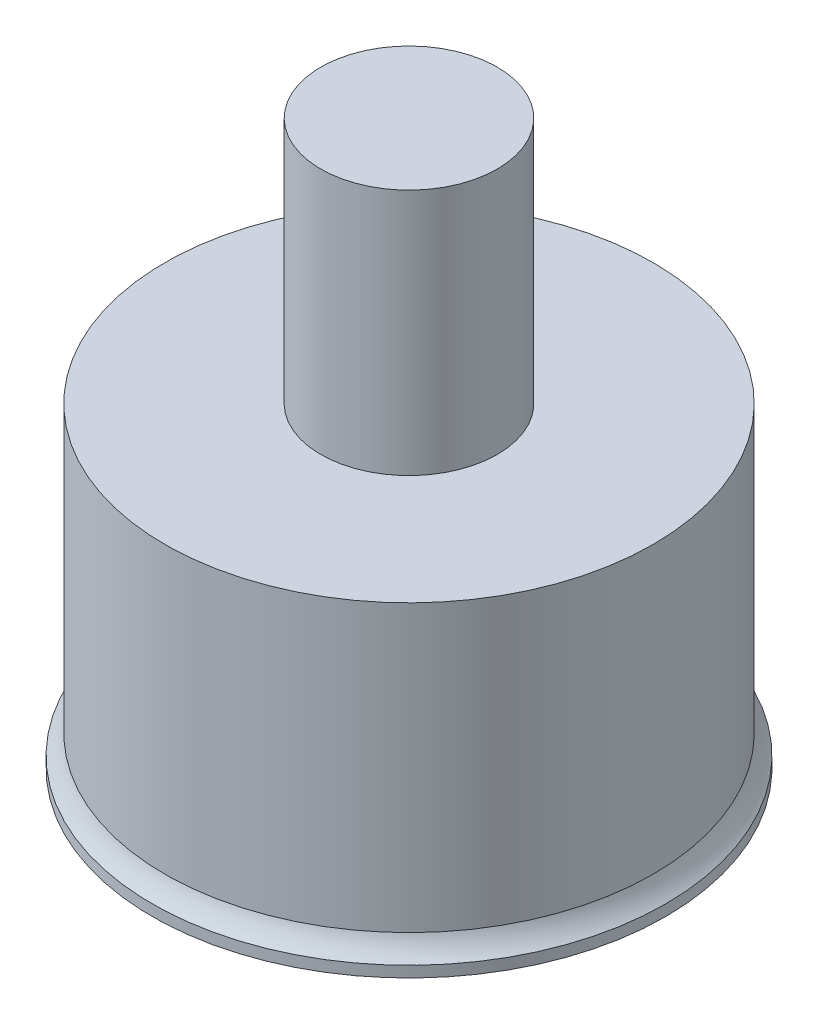
ISO-10303-21;
HEADER;
FILE_DESCRIPTION(('STEP AP214'),'2;1');
FILE_NAME('part.step','',(''),(''),'','','');
FILE_SCHEMA(('AUTOMOTIVE_DESIGN { 1 0 10303 214 1 1 1 1 }'));
ENDSEC;
DATA;
#1=APPLICATION_CONTEXT('core data for automotive mechanical design processes');
#2=APPLICATION_PROTOCOL_DEFINITION('international standard','automotive_design',2000,#1);
#3=PRODUCT_CONTEXT('',#1,'mechanical');
#4=PRODUCT('Part','Part','',(#3));
#5=PRODUCT_RELATED_PRODUCT_CATEGORY('part','',(#4));
#6=PRODUCT_DEFINITION_FORMATION('','',#4);
#7=PRODUCT_DEFINITION_CONTEXT('part definition',#1,'design');
#8=PRODUCT_DEFINITION('design','',#6,#7);
#9=PRODUCT_DEFINITION_SHAPE('','',#8);
#10=(LENGTH_UNIT() NAMED_UNIT(*) SI_UNIT(.MILLI.,.METRE.));
#11=(NAMED_UNIT(*) PLANE_ANGLE_UNIT() SI_UNIT($,.RADIAN.));
#12=(NAMED_UNIT(*) SI_UNIT($,.STERADIAN.) SOLID_ANGLE_UNIT());
#13=UNCERTAINTY_MEASURE_WITH_UNIT(LENGTH_MEASURE(1.E-05),#10,'distance_accuracy_value','');
#14=(GEOMETRIC_REPRESENTATION_CONTEXT(3) GLOBAL_UNCERTAINTY_ASSIGNED_CONTEXT((#13)) GLOBAL_UNIT_ASSIGNED_CONTEXT((#10,
#11,#12)) REPRESENTATION_CONTEXT('',''));
#15=CARTESIAN_POINT('',(0.,0.,0.));
#16=DIRECTION('',(0.,0.,1.));
#17=DIRECTION('',(1.,0.,0.));
#18=AXIS2_PLACEMENT_3D('',#15,#16,#17);
#19=CARTESIAN_POINT('',(29.07,0.,0.));
#20=DIRECTION('',(0.,-1.,0.));
#21=DIRECTION('',(1.,0.,0.));
#22=AXIS2_PLACEMENT_3D('',#19,#20,#21);
#23=PLANE('',#22);
#24=CARTESIAN_POINT('',(0.,0.,0.));
#25=DIRECTION('',(0.,-1.,0.));
#26=DIRECTION('',(1.,0.,0.));
#27=AXIS2_PLACEMENT_3D('',#24,#25,#26);
#28=CIRCLE('',#27,29.07);
#29=CARTESIAN_POINT('',(29.07,0.,0.));
#30=VERTEX_POINT('',#29);
#31=EDGE_CURVE('E10',#30,#30,#28,.T.);
#32=ORIENTED_EDGE('',*,*,#31,.T.);
#33=EDGE_LOOP('',(#32));
#34=FACE_BOUND('',#33,.T.);
#35=ADVANCED_FACE('F31',(#34),#23,.T.);
#36=CARTESIAN_POINT('',(0.,0.,0.));
#37=DIRECTION('',(0.,-1.,0.));
#38=DIRECTION('',(1.,0.,0.));
#39=AXIS2_PLACEMENT_3D('',#36,#37,#38);
#40=CYLINDRICAL_SURFACE('',#39,29.07);
#41=CARTESIAN_POINT('',(0.,1.25,0.));
#42=DIRECTION('',(0.,-1.,0.));
#43=DIRECTION('',(1.,0.,0.));
#44=AXIS2_PLACEMENT_3D('',#41,#42,#43);
#45=CIRCLE('',#44,29.07);
#46=CARTESIAN_POINT('',(29.07,1.25,0.));
#47=VERTEX_POINT('',#46);
#48=EDGE_CURVE('E37',#47,#47,#45,.T.);
#49=ORIENTED_EDGE('',*,*,#48,.T.);
#50=EDGE_LOOP('',(#49));
#51=FACE_BOUND('',#50,.T.);
#52=ORIENTED_EDGE('',*,*,#31,.F.);
#53=EDGE_LOOP('',(#52));
#54=FACE_BOUND('',#53,.T.);
#55=ADVANCED_FACE('F69',(#51,#54),#40,.T.);
#56=CARTESIAN_POINT('',(0.,4.96689793985288,0.));
#57=DIRECTION('',(0.,-1.,0.));
#58=DIRECTION('',(1.,0.,0.));
#59=AXIS2_PLACEMENT_3D('',#56,#57,#58);
#60=TOROIDAL_SURFACE('',#59,32.4143489208989,4.99999999999999);
#61=CARTESIAN_POINT('',(0.,3.45,0.));
#62=DIRECTION('',(0.,-1.,0.));
#63=DIRECTION('',(1.,0.,0.));
#64=AXIS2_PLACEMENT_3D('',#61,#62,#63);
#65=CIRCLE('',#64,27.65);
#66=CARTESIAN_POINT('',(27.65,3.45,0.));
#67=VERTEX_POINT('',#66);
#68=EDGE_CURVE('E41',#67,#67,#65,.T.);
#69=ORIENTED_EDGE('',*,*,#68,.T.);
#70=EDGE_LOOP('',(#69));
#71=FACE_BOUND('',#70,.T.);
#72=ORIENTED_EDGE('',*,*,#48,.F.);
#73=EDGE_LOOP('',(#72));
#74=FACE_BOUND('',#73,.T.);
#75=ADVANCED_FACE('F73',(#71,#74),#60,.F.);
#76=CARTESIAN_POINT('',(0.,0.,0.));
#77=DIRECTION('',(0.,-1.,0.));
#78=DIRECTION('',(1.,0.,0.));
#79=AXIS2_PLACEMENT_3D('',#76,#77,#78);
#80=CYLINDRICAL_SURFACE('',#79,27.65);
#81=CARTESIAN_POINT('',(0.,35.8,0.));
#82=DIRECTION('',(0.,-1.,0.));
#83=DIRECTION('',(1.,0.,0.));
#84=AXIS2_PLACEMENT_3D('',#81,#82,#83);
#85=CIRCLE('',#84,27.65);
#86=CARTESIAN_POINT('',(27.65,35.8,0.));
#87=VERTEX_POINT('',#86);
#88=EDGE_CURVE('E45',#87,#87,#85,.T.);
#89=ORIENTED_EDGE('',*,*,#88,.T.);
#90=EDGE_LOOP('',(#89));
#91=FACE_BOUND('',#90,.T.);
#92=ORIENTED_EDGE('',*,*,#68,.F.);
#93=EDGE_LOOP('',(#92));
#94=FACE_BOUND('',#93,.T.);
#95=ADVANCED_FACE('F77',(#91,#94),#80,.T.);
#96=CARTESIAN_POINT('',(27.65,35.8,0.));
#97=DIRECTION('',(0.,1.,0.));
#98=DIRECTION('',(-1.,0.,0.));
#99=AXIS2_PLACEMENT_3D('',#96,#97,#98);
#100=PLANE('',#99);
#101=CARTESIAN_POINT('',(0.,35.8,0.));
#102=DIRECTION('',(0.,-1.,0.));
#103=DIRECTION('',(1.,0.,0.));
#104=AXIS2_PLACEMENT_3D('',#101,#102,#103);
#105=CIRCLE('',#104,10.);
#106=CARTESIAN_POINT('',(10.,35.8,0.));
#107=VERTEX_POINT('',#106);
#108=EDGE_CURVE('E50',#107,#107,#105,.T.);
#109=ORIENTED_EDGE('',*,*,#108,.T.);
#110=EDGE_LOOP('',(#109));
#111=FACE_BOUND('',#110,.T.);
#112=ORIENTED_EDGE('',*,*,#88,.F.);
#113=EDGE_LOOP('',(#112));
#114=FACE_BOUND('',#113,.T.);
#115=ADVANCED_FACE('F66',(#111,#114),#100,.T.);
#116=CARTESIAN_POINT('',(0.,0.,0.));
#117=DIRECTION('',(0.,-1.,0.));
#118=DIRECTION('',(1.,0.,0.));
#119=AXIS2_PLACEMENT_3D('',#116,#117,#118);
#120=CYLINDRICAL_SURFACE('',#119,10.);
#121=CARTESIAN_POINT('',(0.,63.8,0.));
#122=DIRECTION('',(0.,-1.,0.));
#123=DIRECTION('',(1.,0.,0.));
#124=AXIS2_PLACEMENT_3D('',#121,#122,#123);
#125=CIRCLE('',#124,10.);
#126=CARTESIAN_POINT('',(9.99999999999999,63.8,0.));
#127=VERTEX_POINT('',#126);
#128=EDGE_CURVE('E53',#127,#127,#125,.T.);
#129=ORIENTED_EDGE('',*,*,#128,.T.);
#130=EDGE_LOOP('',(#129));
#131=FACE_BOUND('',#130,.T.);
#132=ORIENTED_EDGE('',*,*,#108,.F.);
#133=EDGE_LOOP('',(#132));
#134=FACE_BOUND('',#133,.T.);
#135=ADVANCED_FACE('F57',(#131,#134),#120,.T.);
#136=CARTESIAN_POINT('',(0.,63.8,0.));
#137=DIRECTION('',(0.,1.,0.));
#138=DIRECTION('',(-1.,0.,0.));
#139=AXIS2_PLACEMENT_3D('',#136,#137,#138);
#140=PLANE('',#139);
#141=ORIENTED_EDGE('',*,*,#128,.F.);
#142=EDGE_LOOP('',(#141));
#143=FACE_BOUND('',#142,.T.);
#144=ADVANCED_FACE('F60',(#143),#140,.T.);
#145=CLOSED_SHELL('',(#35,#55,#75,#95,#115,#135,#144));
#146=MANIFOLD_SOLID_BREP('B2',#145);
#147=ADVANCED_BREP_SHAPE_REPRESENTATION('',(#18,#146),#14);
#148=SHAPE_DEFINITION_REPRESENTATION(#9,#147);
ENDSEC;
END-ISO-10303-21;
